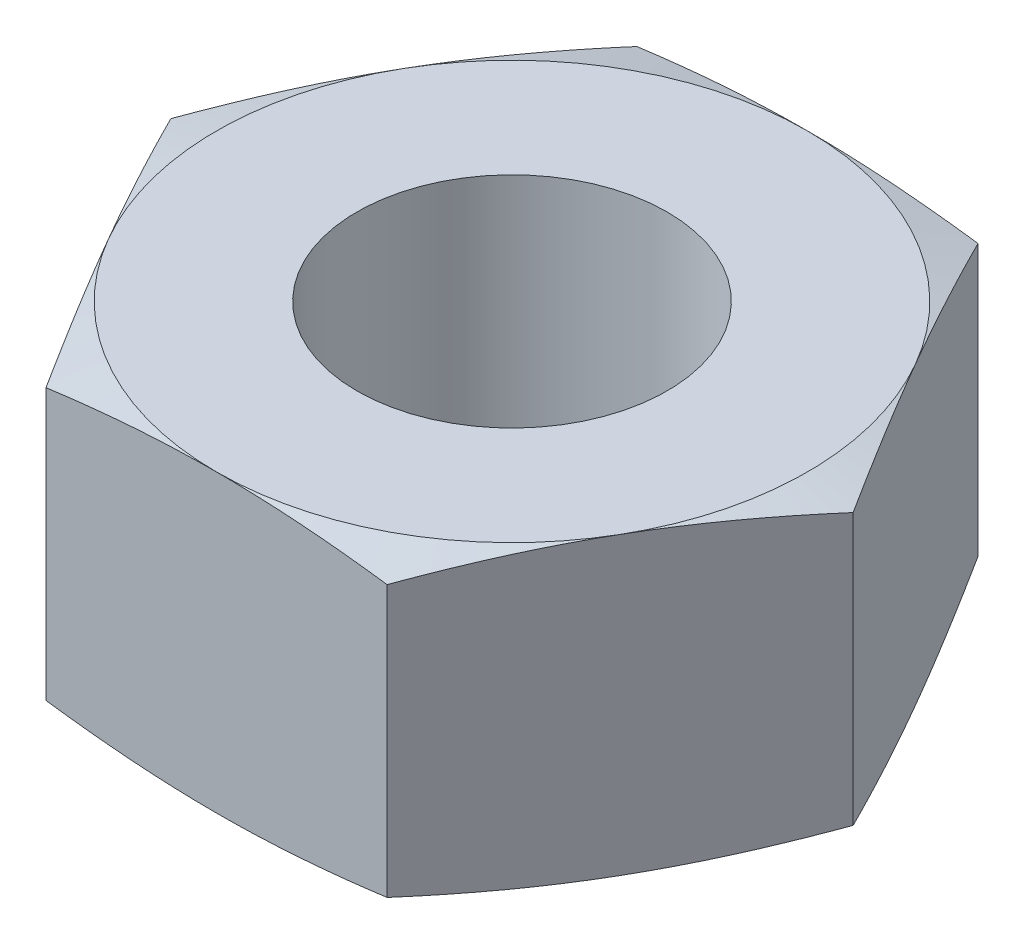
ISO-10303-21;
HEADER;
FILE_DESCRIPTION(('STEP AP214'),'2;1');
FILE_NAME('part.step','',(''),(''),'','','');
FILE_SCHEMA(('AUTOMOTIVE_DESIGN { 1 0 10303 214 1 1 1 1 }'));
ENDSEC;
DATA;
#1=APPLICATION_CONTEXT('core data for automotive mechanical design processes');
#2=APPLICATION_PROTOCOL_DEFINITION('international standard','automotive_design',2000,#1);
#3=PRODUCT_CONTEXT('',#1,'mechanical');
#4=PRODUCT('Part','Part','',(#3));
#5=PRODUCT_RELATED_PRODUCT_CATEGORY('part','',(#4));
#6=PRODUCT_DEFINITION_FORMATION('','',#4);
#7=PRODUCT_DEFINITION_CONTEXT('part definition',#1,'design');
#8=PRODUCT_DEFINITION('design','',#6,#7);
#9=PRODUCT_DEFINITION_SHAPE('','',#8);
#10=(LENGTH_UNIT() NAMED_UNIT(*) SI_UNIT(.MILLI.,.METRE.));
#11=(NAMED_UNIT(*) PLANE_ANGLE_UNIT() SI_UNIT($,.RADIAN.));
#12=(NAMED_UNIT(*) SI_UNIT($,.STERADIAN.) SOLID_ANGLE_UNIT());
#13=UNCERTAINTY_MEASURE_WITH_UNIT(LENGTH_MEASURE(1.E-05),#10,'distance_accuracy_value','');
#14=(GEOMETRIC_REPRESENTATION_CONTEXT(3) GLOBAL_UNCERTAINTY_ASSIGNED_CONTEXT((#13)) GLOBAL_UNIT_ASSIGNED_CONTEXT((#10,
#11,#12)) REPRESENTATION_CONTEXT('',''));
#15=CARTESIAN_POINT('',(0.,0.,0.));
#16=DIRECTION('',(0.,0.,1.));
#17=DIRECTION('',(1.,0.,0.));
#18=AXIS2_PLACEMENT_3D('',#15,#16,#17);
#19=CARTESIAN_POINT('',(0.,4.,0.));
#20=DIRECTION('',(0.,1.,0.));
#21=DIRECTION('',(0.,0.,1.));
#22=AXIS2_PLACEMENT_3D('',#19,#20,#21);
#23=PLANE('',#22);
#24=CARTESIAN_POINT('',(0.,4.,0.));
#25=DIRECTION('',(0.,1.,0.));
#26=DIRECTION('',(0.,0.,1.));
#27=AXIS2_PLACEMENT_3D('',#24,#25,#26);
#28=CIRCLE('',#27,2.1);
#29=CARTESIAN_POINT('',(0.,4.,2.1));
#30=VERTEX_POINT('',#29);
#31=EDGE_CURVE('E293',#30,#30,#28,.T.);
#32=ORIENTED_EDGE('',*,*,#31,.F.);
#33=EDGE_LOOP('',(#32));
#34=FACE_BOUND('',#33,.T.);
#35=CARTESIAN_POINT('',(0.,4.,0.));
#36=DIRECTION('',(0.,1.,0.));
#37=DIRECTION('',(0.,0.,1.));
#38=AXIS2_PLACEMENT_3D('',#35,#36,#37);
#39=CIRCLE('',#38,3.99999999999998);
#40=CARTESIAN_POINT('',(-3.46410161513773,4.,2.00000000000002));
#41=VERTEX_POINT('',#40);
#42=CARTESIAN_POINT('',(0.,4.,3.99999999999998));
#43=VERTEX_POINT('',#42);
#44=EDGE_CURVE('E48',#41,#43,#39,.T.);
#45=ORIENTED_EDGE('',*,*,#44,.T.);
#46=CARTESIAN_POINT('',(0.,4.,0.));
#47=DIRECTION('',(0.,1.,0.));
#48=DIRECTION('',(0.,0.,1.));
#49=AXIS2_PLACEMENT_3D('',#46,#47,#48);
#50=CIRCLE('',#49,3.99999999999998);
#51=CARTESIAN_POINT('',(3.46410161513775,4.,1.99999999999997));
#52=VERTEX_POINT('',#51);
#53=EDGE_CURVE('E146',#43,#52,#50,.T.);
#54=ORIENTED_EDGE('',*,*,#53,.T.);
#55=CARTESIAN_POINT('',(3.46410161513774,4.,-2.));
#56=VERTEX_POINT('',#55);
#57=EDGE_CURVE('E11',#52,#56,#39,.T.);
#58=ORIENTED_EDGE('',*,*,#57,.T.);
#59=CARTESIAN_POINT('',(0.,4.,-3.99999999999998));
#60=VERTEX_POINT('',#59);
#61=EDGE_CURVE('E52',#56,#60,#39,.T.);
#62=ORIENTED_EDGE('',*,*,#61,.T.);
#63=CARTESIAN_POINT('',(-3.46410161513775,4.,-1.99999999999997));
#64=VERTEX_POINT('',#63);
#65=EDGE_CURVE('E506',#60,#64,#39,.T.);
#66=ORIENTED_EDGE('',*,*,#65,.T.);
#67=EDGE_CURVE('E187',#64,#41,#39,.T.);
#68=ORIENTED_EDGE('',*,*,#67,.T.);
#69=EDGE_LOOP('',(#45,#54,#58,#62,#66,#68));
#70=FACE_BOUND('',#69,.T.);
#71=ADVANCED_FACE('F43',(#34,#70),#23,.T.);
#72=CARTESIAN_POINT('',(0.,0.,0.));
#73=DIRECTION('',(0.,1.,0.));
#74=DIRECTION('',(0.,0.,1.));
#75=AXIS2_PLACEMENT_3D('',#72,#73,#74);
#76=PLANE('',#75);
#77=CARTESIAN_POINT('',(0.,0.,0.));
#78=DIRECTION('',(0.,1.,0.));
#79=DIRECTION('',(0.,0.,1.));
#80=AXIS2_PLACEMENT_3D('',#77,#78,#79);
#81=CIRCLE('',#80,2.1);
#82=CARTESIAN_POINT('',(0.,0.,2.1));
#83=VERTEX_POINT('',#82);
#84=EDGE_CURVE('E173',#83,#83,#81,.T.);
#85=ORIENTED_EDGE('',*,*,#84,.T.);
#86=EDGE_LOOP('',(#85));
#87=FACE_BOUND('',#86,.T.);
#88=CARTESIAN_POINT('',(0.,0.,0.));
#89=DIRECTION('',(0.,1.,0.));
#90=DIRECTION('',(0.,0.,1.));
#91=AXIS2_PLACEMENT_3D('',#88,#89,#90);
#92=CIRCLE('',#91,3.99999999999998);
#93=CARTESIAN_POINT('',(0.,0.,3.99999999999998));
#94=VERTEX_POINT('',#93);
#95=CARTESIAN_POINT('',(3.46410161513775,0.,1.99999999999997));
#96=VERTEX_POINT('',#95);
#97=EDGE_CURVE('E493',#94,#96,#92,.T.);
#98=ORIENTED_EDGE('',*,*,#97,.F.);
#99=CARTESIAN_POINT('',(0.,0.,0.));
#100=DIRECTION('',(0.,1.,0.));
#101=DIRECTION('',(0.,0.,1.));
#102=AXIS2_PLACEMENT_3D('',#99,#100,#101);
#103=CIRCLE('',#102,3.99999999999998);
#104=CARTESIAN_POINT('',(-3.46410161513773,0.,2.00000000000002));
#105=VERTEX_POINT('',#104);
#106=EDGE_CURVE('E142',#105,#94,#103,.T.);
#107=ORIENTED_EDGE('',*,*,#106,.F.);
#108=CARTESIAN_POINT('',(-3.46410161513775,0.,-1.99999999999997));
#109=VERTEX_POINT('',#108);
#110=EDGE_CURVE('E185',#109,#105,#103,.T.);
#111=ORIENTED_EDGE('',*,*,#110,.F.);
#112=CARTESIAN_POINT('',(0.,0.,-3.99999999999998));
#113=VERTEX_POINT('',#112);
#114=EDGE_CURVE('E184',#113,#109,#103,.T.);
#115=ORIENTED_EDGE('',*,*,#114,.F.);
#116=CARTESIAN_POINT('',(3.46410161513774,0.,-2.));
#117=VERTEX_POINT('',#116);
#118=EDGE_CURVE('E183',#117,#113,#103,.T.);
#119=ORIENTED_EDGE('',*,*,#118,.F.);
#120=EDGE_CURVE('E181',#96,#117,#103,.T.);
#121=ORIENTED_EDGE('',*,*,#120,.F.);
#122=EDGE_LOOP('',(#98,#107,#111,#115,#119,#121));
#123=FACE_BOUND('',#122,.T.);
#124=ADVANCED_FACE('F205',(#87,#123),#76,.F.);
#125=CARTESIAN_POINT('',(0.,4.,0.));
#126=DIRECTION('',(0.,1.,0.));
#127=DIRECTION('',(0.,0.,1.));
#128=AXIS2_PLACEMENT_3D('',#125,#126,#127);
#129=CYLINDRICAL_SURFACE('',#128,2.1);
#130=ORIENTED_EDGE('',*,*,#84,.F.);
#131=EDGE_LOOP('',(#130));
#132=FACE_BOUND('',#131,.T.);
#133=ORIENTED_EDGE('',*,*,#31,.T.);
#134=EDGE_LOOP('',(#133));
#135=FACE_BOUND('',#134,.T.);
#136=ADVANCED_FACE('F247',(#132,#135),#129,.F.);
#137=CARTESIAN_POINT('',(0.,0.422899040959917,0.));
#138=DIRECTION('',(0.,1.,0.));
#139=DIRECTION('',(0.,0.,1.));
#140=AXIS2_PLACEMENT_3D('',#137,#138,#139);
#141=CONICAL_SURFACE('',#140,5.57828070733457,1.30899693899575);
#142=CARTESIAN_POINT('',(-2.30928560670462,0.165838478577418,4.0002));
#143=CARTESIAN_POINT('',(-2.40519879285118,0.140126969741108,3.83407348847834));
#144=CARTESIAN_POINT('',(-2.50128588853261,0.116785101468864,3.66764575680638));
#145=CARTESIAN_POINT('',(-2.69379944202099,0.0757755542841959,3.33420250101889));
#146=CARTESIAN_POINT('',(-2.7902260216564,0.0581101804583594,3.16718676589027));
#147=CARTESIAN_POINT('',(-2.98283386677355,0.0294849807645795,2.83358019221102));
#148=CARTESIAN_POINT('',(-3.07901382964738,0.0184910158054582,2.66699160984346));
#149=CARTESIAN_POINT('',(-3.27149641829101,0.00374922650766673,2.33360198674031));
#150=CARTESIAN_POINT('',(-3.36779901671437,0.,2.16680099337016));
#151=CARTESIAN_POINT('',(-3.56040421356107,0.,1.83319900662987));
#152=CARTESIAN_POINT('',(-3.65670681198442,0.0037492265076667,1.66639801325973));
#153=CARTESIAN_POINT('',(-3.84918940062806,0.0184910158054582,1.33300839015657));
#154=CARTESIAN_POINT('',(-3.94536936350189,0.0294849807645796,1.16641980778901));
#155=CARTESIAN_POINT('',(-4.13797720861904,0.0581101804583595,0.832813234109763));
#156=CARTESIAN_POINT('',(-4.23440378825445,0.0757755542841959,0.665797498981147));
#157=CARTESIAN_POINT('',(-4.42691734174282,0.116785101468864,0.332354243193657));
#158=CARTESIAN_POINT('',(-4.52300443742425,0.140126969741107,0.165926511521694));
#159=CARTESIAN_POINT('',(-4.61891762357082,0.165838478577418,-0.000199999999967405));
#160=B_SPLINE_CURVE_WITH_KNOTS('',3,(#142,#143,#144,#145,#146,#147,#148,#149,#150,#151,#152,
#153,#154,#155,#156,#157,#158,#159),.UNSPECIFIED.,.F.,.F.,(4,2,2,2,2,2,2,2,4),(0.,
0.580655908162844,1.1615473094924,1.73944052622642,2.31722188451987,2.89500324281332,
3.47289645954734,4.05378786087689,4.63444376903974),.UNSPECIFIED.);
#161=CARTESIAN_POINT('',(-2.3094010767586,0.165807537309234,4.));
#162=VERTEX_POINT('',#161);
#163=EDGE_CURVE('E139',#162,#105,#160,.T.);
#164=ORIENTED_EDGE('',*,*,#163,.T.);
#165=ORIENTED_EDGE('',*,*,#106,.T.);
#166=CARTESIAN_POINT('',(6.94772321100404,1.07632798891099,3.9999999999999));
#167=CARTESIAN_POINT('',(6.77939158950925,1.03724238650687,3.99999999999991));
#168=CARTESIAN_POINT('',(6.61098359218751,0.998485395888132,3.99999999999991));
#169=CARTESIAN_POINT('',(6.27398313531609,0.921769358553381,3.99999999999991));
#170=CARTESIAN_POINT('',(6.10539067276069,0.883810325049425,3.99999999999991));
#171=CARTESIAN_POINT('',(5.59923083278248,0.771328386811078,3.99999999999992));
#172=CARTESIAN_POINT('',(5.26134738191992,0.698216174034046,3.99999999999992));
#173=CARTESIAN_POINT('',(4.58128287002549,0.556789279763775,3.99999999999993));
#174=CARTESIAN_POINT('',(4.23909108460488,0.488525600189578,3.99999999999993));
#175=CARTESIAN_POINT('',(3.55310904291433,0.360267367588469,3.99999999999994));
#176=CARTESIAN_POINT('',(3.20931865207956,0.300273524206282,3.99999999999994));
#177=CARTESIAN_POINT('',(2.52901621800144,0.194152518883908,3.99999999999995));
#178=CARTESIAN_POINT('',(2.19255782304209,0.147695125375858,3.99999999999995));
#179=CARTESIAN_POINT('',(1.68647452707679,0.0906473270946316,3.99999999999996));
#180=CARTESIAN_POINT('',(1.51756269506731,0.0737387266124556,3.99999999999996));
#181=CARTESIAN_POINT('',(1.1793270364912,0.0447876576185628,3.99999999999996));
#182=CARTESIAN_POINT('',(1.01000323912352,0.0327448537912942,3.99999999999997));
#183=CARTESIAN_POINT('',(0.671785170305725,0.0141099799446411,3.99999999999997));
#184=CARTESIAN_POINT('',(0.502892202310773,0.00749459258065724,3.99999999999997));
#185=CARTESIAN_POINT('',(0.16497776491788,-3.76369125806029E-05,3.99999999999998));
#186=CARTESIAN_POINT('',(-0.00404370390315559,-0.000954504476006357,3.99999999999998));
#187=CARTESIAN_POINT('',(-0.342032035526624,0.00295930762817505,3.99999999999998));
#188=CARTESIAN_POINT('',(-0.510998893236393,0.00779042170299907,3.99999999999998));
#189=CARTESIAN_POINT('',(-0.848680148318016,0.0229494760117917,3.99999999999999));
#190=CARTESIAN_POINT('',(-1.01739454594467,0.0332774106942313,3.99999999999999));
#191=CARTESIAN_POINT('',(-1.42662162315562,0.0644474380115494,3.99999999999999));
#192=CARTESIAN_POINT('',(-1.66693557970913,0.0878981974886084,3.99999999999999));
#193=CARTESIAN_POINT('',(-2.14655806628689,0.143190256898164,4.));
#194=CARTESIAN_POINT('',(-2.38586663537111,0.175031227744845,4.));
#195=CARTESIAN_POINT('',(-2.86425610164265,0.245353434846045,4.00000000000001));
#196=CARTESIAN_POINT('',(-3.10333394892004,0.283855116355246,4.00000000000001));
#197=CARTESIAN_POINT('',(-3.58063298441912,0.365854706025524,4.00000000000002));
#198=CARTESIAN_POINT('',(-3.81885413005382,0.409352859117265,4.00000000000002));
#199=CARTESIAN_POINT('',(-4.29944374711116,0.501048516405553,4.00000000000002));
#200=CARTESIAN_POINT('',(-4.54179722113558,0.549324027933249,4.00000000000002));
#201=CARTESIAN_POINT('',(-5.02589466222567,0.648836736751685,4.00000000000003));
#202=CARTESIAN_POINT('',(-5.26763862254938,0.700073966653952,4.00000000000003));
#203=CARTESIAN_POINT('',(-5.74933379724671,0.804514441582056,4.00000000000004));
#204=CARTESIAN_POINT('',(-5.98928764717061,0.857705588309563,4.00000000000004));
#205=CARTESIAN_POINT('',(-6.46878560920919,0.965829508531589,4.00000000000005));
#206=CARTESIAN_POINT('',(-6.70832974880123,1.02076215998416,4.00000000000005));
#207=CARTESIAN_POINT('',(-6.94772321100395,1.07632798891099,4.00000000000005));
#208=B_SPLINE_CURVE_WITH_KNOTS('',3,(#166,#167,#168,#169,#170,#171,#172,#173,#174,#175,#176,
#177,#178,#179,#180,#181,#182,#183,#184,#185,#186,#187,#188,#189,#190,#191,#192,#193,#194,#195,
#196,#197,#198,#199,#200,#201,#202,#203,#204,#205,#206,#207),.UNSPECIFIED.,.F.,.F.,(4,2,2,2,2,2,
2,2,2,2,2,2,2,2,2,2,2,2,2,2,4),(0.,0.518428783163195,1.03686614338406,2.0739453682249,
3.12067977056188,4.16750393861245,5.18610652883119,5.69531646025532,6.2044912946223,
6.711466977275,7.21844039714433,7.72545213427288,8.23246335934449,8.95663312479506,
9.68077449065918,10.4071794022565,11.1336199379585,11.8749402337539,12.6162686937938,
13.353597588303,14.0908749256712),.UNSPECIFIED.);
#209=EDGE_CURVE('E140',#94,#162,#208,.T.);
#210=ORIENTED_EDGE('',*,*,#209,.T.);
#211=EDGE_LOOP('',(#164,#165,#210));
#212=FACE_BOUND('',#211,.T.);
#213=ADVANCED_FACE('F138',(#212),#141,.T.);
#214=CARTESIAN_POINT('',(-4.61891762357082,0.165838478577418,0.000200000000032253));
#215=CARTESIAN_POINT('',(-4.52300443742426,0.140126969741107,-0.16592651152163));
#216=CARTESIAN_POINT('',(-4.42691734174283,0.116785101468863,-0.332354243193595));
#217=CARTESIAN_POINT('',(-4.23440378825446,0.0757755542841958,-0.665797498981088));
#218=CARTESIAN_POINT('',(-4.13797720861905,0.0581101804583595,-0.832813234109705));
#219=CARTESIAN_POINT('',(-3.94536936350191,0.0294849807645796,-1.16641980778896));
#220=CARTESIAN_POINT('',(-3.84918940062808,0.018491015805458,-1.33300839015652));
#221=CARTESIAN_POINT('',(-3.65670681198445,0.00374922650766649,-1.66639801325967));
#222=CARTESIAN_POINT('',(-3.5604042135611,0.,-1.83319900662982));
#223=CARTESIAN_POINT('',(-3.3677990167144,0.,-2.16680099337011));
#224=CARTESIAN_POINT('',(-3.27149641829105,0.00374922650766673,-2.33360198674026));
#225=CARTESIAN_POINT('',(-3.07901382964741,0.0184910158054582,-2.66699160984342));
#226=CARTESIAN_POINT('',(-2.98283386677359,0.0294849807645795,-2.83358019221098));
#227=CARTESIAN_POINT('',(-2.79022602165644,0.0581101804583595,-3.16718676589023));
#228=CARTESIAN_POINT('',(-2.69379944202103,0.0757755542841959,-3.33420250101885));
#229=CARTESIAN_POINT('',(-2.50128588853266,0.116785101468864,-3.66764575680634));
#230=CARTESIAN_POINT('',(-2.40519879285124,0.140126969741107,-3.83407348847831));
#231=CARTESIAN_POINT('',(-2.30928560670467,0.165838478577418,-4.00019999999997));
#232=B_SPLINE_CURVE_WITH_KNOTS('',3,(#214,#215,#216,#217,#218,#219,#220,#221,#222,#223,#224,
#225,#226,#227,#228,#229,#230,#231),.UNSPECIFIED.,.F.,.F.,(4,2,2,2,2,2,2,2,4),(0.,
0.580655908162844,1.1615473094924,1.73944052622642,2.31722188451987,2.89500324281332,
3.47289645954734,4.05378786087689,4.63444376903974),.UNSPECIFIED.);
#233=CARTESIAN_POINT('',(-4.61880215351698,0.165807537309517,0.));
#234=VERTEX_POINT('',#233);
#235=EDGE_CURVE('E207',#234,#109,#232,.T.);
#236=ORIENTED_EDGE('',*,*,#235,.T.);
#237=ORIENTED_EDGE('',*,*,#110,.T.);
#238=EDGE_CURVE('E158',#105,#234,#160,.T.);
#239=ORIENTED_EDGE('',*,*,#238,.T.);
#240=EDGE_LOOP('',(#236,#237,#239));
#241=FACE_BOUND('',#240,.T.);
#242=ADVANCED_FACE('F241',(#241),#141,.T.);
#243=CARTESIAN_POINT('',(-6.94772321100401,1.07632798891099,-3.99999999999996));
#244=CARTESIAN_POINT('',(-6.77939158950922,1.03724238650687,-3.99999999999996));
#245=CARTESIAN_POINT('',(-6.61098359218748,0.998485395888133,-3.99999999999996));
#246=CARTESIAN_POINT('',(-6.27398313531606,0.921769358553382,-3.99999999999996));
#247=CARTESIAN_POINT('',(-6.10539067276067,0.883810325049426,-3.99999999999996));
#248=CARTESIAN_POINT('',(-5.59923083278245,0.771328386811078,-3.99999999999996));
#249=CARTESIAN_POINT('',(-5.26134738191988,0.698216174034046,-3.99999999999996));
#250=CARTESIAN_POINT('',(-4.58128287002546,0.556789279763776,-3.99999999999996));
#251=CARTESIAN_POINT('',(-4.23909108460485,0.488525600189578,-3.99999999999996));
#252=CARTESIAN_POINT('',(-3.5531090429143,0.360267367588469,-3.99999999999997));
#253=CARTESIAN_POINT('',(-3.20931865207953,0.300273524206282,-3.99999999999997));
#254=CARTESIAN_POINT('',(-2.52901621800141,0.194152518883908,-3.99999999999997));
#255=CARTESIAN_POINT('',(-2.19255782304207,0.147695125375858,-3.99999999999997));
#256=CARTESIAN_POINT('',(-1.68647452707676,0.0906473270946317,-3.99999999999997));
#257=CARTESIAN_POINT('',(-1.51756269506728,0.0737387266124559,-3.99999999999997));
#258=CARTESIAN_POINT('',(-1.17932703649117,0.0447876576185631,-3.99999999999997));
#259=CARTESIAN_POINT('',(-1.01000323912349,0.0327448537912944,-3.99999999999997));
#260=CARTESIAN_POINT('',(-0.671785170305695,0.0141099799446411,-3.99999999999997));
#261=CARTESIAN_POINT('',(-0.502892202310743,0.00749459258065727,-3.99999999999998));
#262=CARTESIAN_POINT('',(-0.16497776491785,-3.76369125804631E-05,-3.99999999999998));
#263=CARTESIAN_POINT('',(0.00404370390318594,-0.000954504476006079,-3.99999999999998));
#264=CARTESIAN_POINT('',(0.342032035526655,0.00295930762817535,-3.99999999999998));
#265=CARTESIAN_POINT('',(0.510998893236424,0.00779042170299926,-3.99999999999998));
#266=CARTESIAN_POINT('',(0.848680148318047,0.0229494760117919,-3.99999999999998));
#267=CARTESIAN_POINT('',(1.0173945459447,0.0332774106942315,-3.99999999999998));
#268=CARTESIAN_POINT('',(1.42662162315565,0.0644474380115498,-3.99999999999998));
#269=CARTESIAN_POINT('',(1.66693557970916,0.0878981974886089,-3.99999999999998));
#270=CARTESIAN_POINT('',(2.14655806628692,0.143190256898164,-3.99999999999998));
#271=CARTESIAN_POINT('',(2.38586663537114,0.175031227744845,-3.99999999999998));
#272=CARTESIAN_POINT('',(2.86425610164268,0.245353434846045,-3.99999999999999));
#273=CARTESIAN_POINT('',(3.10333394892007,0.283855116355246,-3.99999999999999));
#274=CARTESIAN_POINT('',(3.58063298441914,0.365854706025524,-3.99999999999999));
#275=CARTESIAN_POINT('',(3.81885413005384,0.409352859117265,-3.99999999999999));
#276=CARTESIAN_POINT('',(4.29944374711119,0.501048516405553,-3.99999999999999));
#277=CARTESIAN_POINT('',(4.54179722113561,0.549324027933249,-3.99999999999999));
#278=CARTESIAN_POINT('',(5.0258946622257,0.648836736751685,-3.99999999999999));
#279=CARTESIAN_POINT('',(5.26763862254941,0.700073966653952,-3.99999999999999));
#280=CARTESIAN_POINT('',(5.74933379724674,0.804514441582055,-4.));
#281=CARTESIAN_POINT('',(5.98928764717064,0.857705588309563,-4.));
#282=CARTESIAN_POINT('',(6.46878560920922,0.965829508531588,-4.));
#283=CARTESIAN_POINT('',(6.70832974880125,1.02076215998416,-4.));
#284=CARTESIAN_POINT('',(6.94772321100398,1.07632798891099,-4.));
#285=B_SPLINE_CURVE_WITH_KNOTS('',3,(#243,#244,#245,#246,#247,#248,#249,#250,#251,#252,#253,
#254,#255,#256,#257,#258,#259,#260,#261,#262,#263,#264,#265,#266,#267,#268,#269,#270,#271,#272,
#273,#274,#275,#276,#277,#278,#279,#280,#281,#282,#283,#284),.UNSPECIFIED.,.F.,.F.,(4,2,2,2,2,2,
2,2,2,2,2,2,2,2,2,2,2,2,2,2,4),(0.,0.518428783163193,1.03686614338406,2.0739453682249,
3.12067977056188,4.16750393861245,5.18610652883119,5.69531646025532,6.2044912946223,
6.711466977275,7.21844039714434,7.72545213427288,8.2324633593445,8.95663312479507,
9.68077449065918,10.4071794022565,11.1336199379585,11.8749402337539,12.6162686937938,
13.353597588303,14.0908749256712),.UNSPECIFIED.);
#286=CARTESIAN_POINT('',(-2.30940107675851,0.165807537309517,-3.99999999999997));
#287=VERTEX_POINT('',#286);
#288=EDGE_CURVE('E200',#287,#113,#285,.T.);
#289=ORIENTED_EDGE('',*,*,#288,.T.);
#290=ORIENTED_EDGE('',*,*,#114,.T.);
#291=EDGE_CURVE('E197',#109,#287,#232,.T.);
#292=ORIENTED_EDGE('',*,*,#291,.T.);
#293=EDGE_LOOP('',(#289,#290,#292));
#294=FACE_BOUND('',#293,.T.);
#295=ADVANCED_FACE('F194',(#294),#141,.T.);
#296=CARTESIAN_POINT('',(2.30940107675848,0.165807537309517,-3.99999999999998));
#297=VERTEX_POINT('',#296);
#298=EDGE_CURVE('E211',#113,#297,#285,.T.);
#299=ORIENTED_EDGE('',*,*,#298,.T.);
#300=CARTESIAN_POINT('',(2.30928560670464,0.165838478577418,-4.00019999999998));
#301=CARTESIAN_POINT('',(2.40519879285121,0.140126969741107,-3.83407348847832));
#302=CARTESIAN_POINT('',(2.50128588853264,0.116785101468863,-3.66764575680636));
#303=CARTESIAN_POINT('',(2.69379944202101,0.0757755542841957,-3.33420250101887));
#304=CARTESIAN_POINT('',(2.79022602165642,0.0581101804583593,-3.16718676589025));
#305=CARTESIAN_POINT('',(2.98283386677357,0.0294849807645794,-2.833580192211));
#306=CARTESIAN_POINT('',(3.0790138296474,0.018491015805458,-2.66699160984344));
#307=CARTESIAN_POINT('',(3.27149641829103,0.00374922650766657,-2.33360198674028));
#308=CARTESIAN_POINT('',(3.36779901671438,0.,-2.16680099337014));
#309=CARTESIAN_POINT('',(3.56040421356108,0.,-1.83319900662985));
#310=CARTESIAN_POINT('',(3.65670681198443,0.00374922650766677,-1.6663980132597));
#311=CARTESIAN_POINT('',(3.84918940062807,0.0184910158054583,-1.33300839015655));
#312=CARTESIAN_POINT('',(3.9453693635019,0.0294849807645797,-1.16641980778899));
#313=CARTESIAN_POINT('',(4.13797720861904,0.0581101804583597,-0.832813234109734));
#314=CARTESIAN_POINT('',(4.23440378825445,0.0757755542841961,-0.665797498981118));
#315=CARTESIAN_POINT('',(4.42691734174283,0.116785101468864,-0.332354243193626));
#316=CARTESIAN_POINT('',(4.52300443742426,0.140126969741108,-0.165926511521662));
#317=CARTESIAN_POINT('',(4.61891762357082,0.165838478577418,0.000199999999999788));
#318=B_SPLINE_CURVE_WITH_KNOTS('',3,(#300,#301,#302,#303,#304,#305,#306,#307,#308,#309,#310,
#311,#312,#313,#314,#315,#316,#317),.UNSPECIFIED.,.F.,.F.,(4,2,2,2,2,2,2,2,4),(0.,
0.580655908162844,1.1615473094924,1.73944052622642,2.31722188451987,2.89500324281332,
3.47289645954734,4.05378786087689,4.63444376903974),.UNSPECIFIED.);
#319=EDGE_CURVE('E215',#297,#117,#318,.T.);
#320=ORIENTED_EDGE('',*,*,#319,.T.);
#321=ORIENTED_EDGE('',*,*,#118,.T.);
#322=EDGE_LOOP('',(#299,#320,#321));
#323=FACE_BOUND('',#322,.T.);
#324=ADVANCED_FACE('F245',(#323),#141,.T.);
#325=CARTESIAN_POINT('',(4.61880215351698,0.165807537309517,0.));
#326=VERTEX_POINT('',#325);
#327=EDGE_CURVE('E214',#117,#326,#318,.T.);
#328=ORIENTED_EDGE('',*,*,#327,.T.);
#329=CARTESIAN_POINT('',(4.61891762357082,0.165838478577418,-0.000200000000000215));
#330=CARTESIAN_POINT('',(4.52300443742426,0.140126969741108,0.16592651152166));
#331=CARTESIAN_POINT('',(4.42691734174283,0.116785101468865,0.332354243193623));
#332=CARTESIAN_POINT('',(4.23440378825446,0.0757755542841983,0.665797498981111));
#333=CARTESIAN_POINT('',(4.13797720861906,0.0581101804583624,0.832813234109726));
#334=CARTESIAN_POINT('',(3.94536936350192,0.0294849807645832,1.16641980778898));
#335=CARTESIAN_POINT('',(3.84918940062809,0.018491015805462,1.33300839015654));
#336=CARTESIAN_POINT('',(3.65670681198446,0.00374922650767091,1.66639801325969));
#337=CARTESIAN_POINT('',(3.56040421356111,0.,1.83319900662983));
#338=CARTESIAN_POINT('',(3.36779901671441,0.,2.16680099337012));
#339=CARTESIAN_POINT('',(3.27149641829106,0.00374922650767076,2.33360198674026));
#340=CARTESIAN_POINT('',(3.07901382964743,0.0184910158054618,2.66699160984342));
#341=CARTESIAN_POINT('',(2.98283386677361,0.029484980764583,2.83358019221098));
#342=CARTESIAN_POINT('',(2.79022602165647,0.0581101804583621,3.16718676589022));
#343=CARTESIAN_POINT('',(2.69379944202106,0.0757755542841979,3.33420250101884));
#344=CARTESIAN_POINT('',(2.50128588853269,0.116785101468864,3.66764575680633));
#345=CARTESIAN_POINT('',(2.40519879285126,0.140126969741107,3.83407348847829));
#346=CARTESIAN_POINT('',(2.3092856067047,0.165838478577418,4.00019999999995));
#347=B_SPLINE_CURVE_WITH_KNOTS('',3,(#329,#330,#331,#332,#333,#334,#335,#336,#337,#338,#339,
#340,#341,#342,#343,#344,#345,#346),.UNSPECIFIED.,.F.,.F.,(4,2,2,2,2,2,2,2,4),(0.,
0.580655908162836,1.16154730949238,1.73944052622639,2.31722188451984,2.89500324281328,
3.4728964595473,4.05378786087684,4.63444376903968),.UNSPECIFIED.);
#348=EDGE_CURVE('E70',#326,#96,#347,.T.);
#349=ORIENTED_EDGE('',*,*,#348,.T.);
#350=ORIENTED_EDGE('',*,*,#120,.T.);
#351=EDGE_LOOP('',(#328,#349,#350));
#352=FACE_BOUND('',#351,.T.);
#353=ADVANCED_FACE('F405',(#352),#141,.T.);
#354=CARTESIAN_POINT('',(2.30940107675854,0.165807537309517,3.99999999999995));
#355=VERTEX_POINT('',#354);
#356=EDGE_CURVE('E157',#96,#355,#347,.T.);
#357=ORIENTED_EDGE('',*,*,#356,.T.);
#358=EDGE_CURVE('E150',#355,#94,#208,.T.);
#359=ORIENTED_EDGE('',*,*,#358,.T.);
#360=ORIENTED_EDGE('',*,*,#97,.T.);
#361=EDGE_LOOP('',(#357,#359,#360));
#362=FACE_BOUND('',#361,.T.);
#363=ADVANCED_FACE('F395',(#362),#141,.T.);
#364=CARTESIAN_POINT('',(0.,4.,0.));
#365=DIRECTION('',(0.,-1.,0.));
#366=DIRECTION('',(0.,0.,-1.));
#367=AXIS2_PLACEMENT_3D('',#364,#365,#366);
#368=CONICAL_SURFACE('',#367,3.99999999999998,1.30899693899575);
#369=CARTESIAN_POINT('',(-4.61891762357082,3.83416152142258,-0.000199999999967788));
#370=CARTESIAN_POINT('',(-4.52300443742425,3.85987303025889,0.165926511521693));
#371=CARTESIAN_POINT('',(-4.42691734174282,3.88321489853114,0.332354243193657));
#372=CARTESIAN_POINT('',(-4.23440378825445,3.9242244457158,0.665797498981147));
#373=CARTESIAN_POINT('',(-4.13797720861904,3.94188981954164,0.832813234109762));
#374=CARTESIAN_POINT('',(-3.94536936350189,3.97051501923542,1.16641980778901));
#375=CARTESIAN_POINT('',(-3.84918940062806,3.98150898419454,1.33300839015657));
#376=CARTESIAN_POINT('',(-3.65670681198442,3.99625077349233,1.66639801325973));
#377=CARTESIAN_POINT('',(-3.56040421356107,4.,1.83319900662987));
#378=CARTESIAN_POINT('',(-3.36779901671437,4.,2.16680099337016));
#379=CARTESIAN_POINT('',(-3.27149641829101,3.99625077349233,2.33360198674031));
#380=CARTESIAN_POINT('',(-3.07901382964738,3.98150898419454,2.66699160984346));
#381=CARTESIAN_POINT('',(-2.98283386677355,3.97051501923542,2.83358019221102));
#382=CARTESIAN_POINT('',(-2.7902260216564,3.94188981954164,3.16718676589027));
#383=CARTESIAN_POINT('',(-2.69379944202099,3.9242244457158,3.33420250101888));
#384=CARTESIAN_POINT('',(-2.50128588853261,3.88321489853114,3.66764575680638));
#385=CARTESIAN_POINT('',(-2.40519879285118,3.85987303025889,3.83407348847834));
#386=CARTESIAN_POINT('',(-2.30928560670462,3.83416152142258,4.0002));
#387=B_SPLINE_CURVE_WITH_KNOTS('',3,(#369,#370,#371,#372,#373,#374,#375,#376,#377,#378,#379,
#380,#381,#382,#383,#384,#385,#386),.UNSPECIFIED.,.F.,.F.,(4,2,2,2,2,2,2,2,4),(0.,
0.580655908162844,1.1615473094924,1.73944052622642,2.31722188451987,2.89500324281332,
3.47289645954734,4.05378786087689,4.63444376903974),.UNSPECIFIED.);
#388=CARTESIAN_POINT('',(-2.30940107675845,3.83419246269048,4.));
#389=VERTEX_POINT('',#388);
#390=EDGE_CURVE('E319',#41,#389,#387,.T.);
#391=ORIENTED_EDGE('',*,*,#390,.T.);
#392=CARTESIAN_POINT('',(-6.94772321100395,2.92367201108901,4.00000000000005));
#393=CARTESIAN_POINT('',(-6.77939158950917,2.96275761349313,4.00000000000005));
#394=CARTESIAN_POINT('',(-6.61098359218743,3.00151460411187,4.00000000000005));
#395=CARTESIAN_POINT('',(-6.27398313531601,3.07823064144662,4.00000000000004));
#396=CARTESIAN_POINT('',(-6.10539067276061,3.11618967495057,4.00000000000004));
#397=CARTESIAN_POINT('',(-5.59923083278239,3.22867161318892,4.00000000000004));
#398=CARTESIAN_POINT('',(-5.26134738191983,3.30178382596595,4.00000000000003));
#399=CARTESIAN_POINT('',(-4.58128287002541,3.44321072023622,4.00000000000002));
#400=CARTESIAN_POINT('',(-4.2390910846048,3.51147439981042,4.00000000000002));
#401=CARTESIAN_POINT('',(-3.55310904291425,3.63973263241153,4.00000000000001));
#402=CARTESIAN_POINT('',(-3.20931865207948,3.69972647579372,4.00000000000001));
#403=CARTESIAN_POINT('',(-2.52901621800136,3.80584748111609,4.));
#404=CARTESIAN_POINT('',(-2.19255782304201,3.85230487462414,4.));
#405=CARTESIAN_POINT('',(-1.6864745270767,3.90935267290537,3.99999999999999));
#406=CARTESIAN_POINT('',(-1.51756269506723,3.92626127338754,3.99999999999999));
#407=CARTESIAN_POINT('',(-1.17932703649111,3.95521234238144,3.99999999999999));
#408=CARTESIAN_POINT('',(-1.01000323912343,3.96725514620871,3.99999999999999));
#409=CARTESIAN_POINT('',(-0.67178517030564,3.98589002005536,3.99999999999998));
#410=CARTESIAN_POINT('',(-0.502892202310689,3.99250540741934,3.99999999999998));
#411=CARTESIAN_POINT('',(-0.164977764917796,4.00003763691258,3.99999999999998));
#412=CARTESIAN_POINT('',(0.00404370390324045,4.00095450447601,3.99999999999998));
#413=CARTESIAN_POINT('',(0.342032035526709,3.99704069237182,3.99999999999997));
#414=CARTESIAN_POINT('',(0.510998893236478,3.992209578297,3.99999999999997));
#415=CARTESIAN_POINT('',(0.848680148318101,3.97705052398821,3.99999999999997));
#416=CARTESIAN_POINT('',(1.01739454594475,3.96672258930577,3.99999999999997));
#417=CARTESIAN_POINT('',(1.4266216231557,3.93555256198845,3.99999999999996));
#418=CARTESIAN_POINT('',(1.66693557970921,3.91210180251139,3.99999999999996));
#419=CARTESIAN_POINT('',(2.14655806628697,3.85680974310184,3.99999999999995));
#420=CARTESIAN_POINT('',(2.38586663537119,3.82496877225516,3.99999999999995));
#421=CARTESIAN_POINT('',(2.86425610164274,3.75464656515396,3.99999999999995));
#422=CARTESIAN_POINT('',(3.10333394892013,3.71614488364475,3.99999999999994));
#423=CARTESIAN_POINT('',(3.5806329844192,3.63414529397448,3.99999999999994));
#424=CARTESIAN_POINT('',(3.8188541300539,3.59064714088274,3.99999999999994));
#425=CARTESIAN_POINT('',(4.29944374711124,3.49895148359445,3.99999999999993));
#426=CARTESIAN_POINT('',(4.54179722113567,3.45067597206675,3.99999999999993));
#427=CARTESIAN_POINT('',(5.02589466222576,3.35116326324832,3.99999999999992));
#428=CARTESIAN_POINT('',(5.26763862254946,3.29992603334605,3.99999999999992));
#429=CARTESIAN_POINT('',(5.74933379724679,3.19548555841794,3.99999999999992));
#430=CARTESIAN_POINT('',(5.98928764717069,3.14229441169044,3.99999999999991));
#431=CARTESIAN_POINT('',(6.46878560920927,3.03417049146841,3.99999999999991));
#432=CARTESIAN_POINT('',(6.70832974880131,2.97923784001584,3.99999999999991));
#433=CARTESIAN_POINT('',(6.94772321100403,2.92367201108901,3.9999999999999));
#434=B_SPLINE_CURVE_WITH_KNOTS('',3,(#392,#393,#394,#395,#396,#397,#398,#399,#400,#401,#402,
#403,#404,#405,#406,#407,#408,#409,#410,#411,#412,#413,#414,#415,#416,#417,#418,#419,#420,#421,
#422,#423,#424,#425,#426,#427,#428,#429,#430,#431,#432,#433),.UNSPECIFIED.,.F.,.F.,(4,2,2,2,2,2,
2,2,2,2,2,2,2,2,2,2,2,2,2,2,4),(0.,0.518428783163193,1.03686614338406,2.0739453682249,
3.12067977056188,4.16750393861245,5.18610652883119,5.69531646025532,6.2044912946223,
6.711466977275,7.21844039714434,7.72545213427288,8.23246335934449,8.95663312479507,
9.68077449065918,10.4071794022565,11.1336199379585,11.8749402337539,12.6162686937938,
13.353597588303,14.0908749256712),.UNSPECIFIED.);
#435=EDGE_CURVE('E163',#389,#43,#434,.T.);
#436=ORIENTED_EDGE('',*,*,#435,.T.);
#437=ORIENTED_EDGE('',*,*,#44,.F.);
#438=EDGE_LOOP('',(#391,#436,#437));
#439=FACE_BOUND('',#438,.T.);
#440=ADVANCED_FACE('F356',(#439),#368,.T.);
#441=CARTESIAN_POINT('',(-2.30928560670467,3.83416152142258,-4.00019999999997));
#442=CARTESIAN_POINT('',(-2.40519879285124,3.85987303025889,-3.83407348847831));
#443=CARTESIAN_POINT('',(-2.50128588853266,3.88321489853114,-3.66764575680634));
#444=CARTESIAN_POINT('',(-2.69379944202103,3.9242244457158,-3.33420250101885));
#445=CARTESIAN_POINT('',(-2.79022602165644,3.94188981954164,-3.16718676589023));
#446=CARTESIAN_POINT('',(-2.98283386677359,3.97051501923542,-2.83358019221098));
#447=CARTESIAN_POINT('',(-3.07901382964741,3.98150898419454,-2.66699160984342));
#448=CARTESIAN_POINT('',(-3.27149641829105,3.99625077349233,-2.33360198674026));
#449=CARTESIAN_POINT('',(-3.3677990167144,4.,-2.16680099337012));
#450=CARTESIAN_POINT('',(-3.5604042135611,4.,-1.83319900662982));
#451=CARTESIAN_POINT('',(-3.65670681198445,3.99625077349233,-1.66639801325968));
#452=CARTESIAN_POINT('',(-3.84918940062808,3.98150898419454,-1.33300839015652));
#453=CARTESIAN_POINT('',(-3.94536936350191,3.97051501923542,-1.16641980778896));
#454=CARTESIAN_POINT('',(-4.13797720861905,3.94188981954164,-0.832813234109705));
#455=CARTESIAN_POINT('',(-4.23440378825446,3.9242244457158,-0.665797498981089));
#456=CARTESIAN_POINT('',(-4.42691734174283,3.88321489853114,-0.332354243193596));
#457=CARTESIAN_POINT('',(-4.52300443742426,3.85987303025889,-0.165926511521631));
#458=CARTESIAN_POINT('',(-4.61891762357082,3.83416152142258,0.000200000000031967));
#459=B_SPLINE_CURVE_WITH_KNOTS('',3,(#441,#442,#443,#444,#445,#446,#447,#448,#449,#450,#451,
#452,#453,#454,#455,#456,#457,#458),.UNSPECIFIED.,.F.,.F.,(4,2,2,2,2,2,2,2,4),(0.,
0.580655908162844,1.1615473094924,1.73944052622642,2.31722188451987,2.89500324281332,
3.47289645954734,4.05378786087689,4.63444376903974),.UNSPECIFIED.);
#460=CARTESIAN_POINT('',(-4.61880215351698,3.83419246269048,0.));
#461=VERTEX_POINT('',#460);
#462=EDGE_CURVE('E326',#64,#461,#459,.T.);
#463=ORIENTED_EDGE('',*,*,#462,.T.);
#464=EDGE_CURVE('E324',#461,#41,#387,.T.);
#465=ORIENTED_EDGE('',*,*,#464,.T.);
#466=ORIENTED_EDGE('',*,*,#67,.F.);
#467=EDGE_LOOP('',(#463,#465,#466));
#468=FACE_BOUND('',#467,.T.);
#469=ADVANCED_FACE('F377',(#468),#368,.T.);
#470=CARTESIAN_POINT('',(6.94772321100398,2.92367201108901,-4.));
#471=CARTESIAN_POINT('',(6.77939158950919,2.96275761349313,-4.));
#472=CARTESIAN_POINT('',(6.61098359218746,3.00151460411187,-4.));
#473=CARTESIAN_POINT('',(6.27398313531603,3.07823064144662,-4.));
#474=CARTESIAN_POINT('',(6.10539067276064,3.11618967495058,-4.));
#475=CARTESIAN_POINT('',(5.59923083278242,3.22867161318892,-3.99999999999999));
#476=CARTESIAN_POINT('',(5.26134738191986,3.30178382596596,-3.99999999999999));
#477=CARTESIAN_POINT('',(4.58128287002543,3.44321072023622,-3.99999999999999));
#478=CARTESIAN_POINT('',(4.23909108460482,3.51147439981042,-3.99999999999999));
#479=CARTESIAN_POINT('',(3.55310904291428,3.63973263241153,-3.99999999999999));
#480=CARTESIAN_POINT('',(3.2093186520795,3.69972647579372,-3.99999999999999));
#481=CARTESIAN_POINT('',(2.52901621800139,3.80584748111609,-3.99999999999999));
#482=CARTESIAN_POINT('',(2.19255782304204,3.85230487462414,-3.99999999999998));
#483=CARTESIAN_POINT('',(1.68647452707673,3.90935267290537,-3.99999999999998));
#484=CARTESIAN_POINT('',(1.51756269506726,3.92626127338754,-3.99999999999998));
#485=CARTESIAN_POINT('',(1.17932703649114,3.95521234238144,-3.99999999999998));
#486=CARTESIAN_POINT('',(1.01000323912346,3.96725514620871,-3.99999999999998));
#487=CARTESIAN_POINT('',(0.671785170305668,3.98589002005536,-3.99999999999998));
#488=CARTESIAN_POINT('',(0.502892202310717,3.99250540741934,-3.99999999999998));
#489=CARTESIAN_POINT('',(0.164977764917824,4.00003763691258,-3.99999999999998));
#490=CARTESIAN_POINT('',(-0.00404370390321232,4.00095450447601,-3.99999999999998));
#491=CARTESIAN_POINT('',(-0.342032035526681,3.99704069237182,-3.99999999999998));
#492=CARTESIAN_POINT('',(-0.51099889323645,3.992209578297,-3.99999999999998));
#493=CARTESIAN_POINT('',(-0.848680148318072,3.97705052398821,-3.99999999999997));
#494=CARTESIAN_POINT('',(-1.01739454594473,3.96672258930577,-3.99999999999997));
#495=CARTESIAN_POINT('',(-1.42662162315567,3.93555256198845,-3.99999999999997));
#496=CARTESIAN_POINT('',(-1.66693557970918,3.91210180251139,-3.99999999999997));
#497=CARTESIAN_POINT('',(-2.14655806628694,3.85680974310184,-3.99999999999997));
#498=CARTESIAN_POINT('',(-2.38586663537116,3.82496877225516,-3.99999999999997));
#499=CARTESIAN_POINT('',(-2.86425610164271,3.75464656515395,-3.99999999999997));
#500=CARTESIAN_POINT('',(-3.1033339489201,3.71614488364475,-3.99999999999997));
#501=CARTESIAN_POINT('',(-3.58063298441917,3.63414529397448,-3.99999999999997));
#502=CARTESIAN_POINT('',(-3.81885413005387,3.59064714088274,-3.99999999999997));
#503=CARTESIAN_POINT('',(-4.29944374711122,3.49895148359445,-3.99999999999996));
#504=CARTESIAN_POINT('',(-4.54179722113564,3.45067597206675,-3.99999999999996));
#505=CARTESIAN_POINT('',(-5.02589466222573,3.35116326324832,-3.99999999999996));
#506=CARTESIAN_POINT('',(-5.26763862254943,3.29992603334605,-3.99999999999996));
#507=CARTESIAN_POINT('',(-5.74933379724676,3.19548555841795,-3.99999999999996));
#508=CARTESIAN_POINT('',(-5.98928764717066,3.14229441169044,-3.99999999999996));
#509=CARTESIAN_POINT('',(-6.46878560920924,3.03417049146841,-3.99999999999996));
#510=CARTESIAN_POINT('',(-6.70832974880128,2.97923784001584,-3.99999999999996));
#511=CARTESIAN_POINT('',(-6.947723211004,2.92367201108901,-3.99999999999996));
#512=B_SPLINE_CURVE_WITH_KNOTS('',3,(#470,#471,#472,#473,#474,#475,#476,#477,#478,#479,#480,
#481,#482,#483,#484,#485,#486,#487,#488,#489,#490,#491,#492,#493,#494,#495,#496,#497,#498,#499,
#500,#501,#502,#503,#504,#505,#506,#507,#508,#509,#510,#511),.UNSPECIFIED.,.F.,.F.,(4,2,2,2,2,2,
2,2,2,2,2,2,2,2,2,2,2,2,2,2,4),(0.,0.518428783163193,1.03686614338406,2.0739453682249,
3.12067977056188,4.16750393861245,5.18610652883119,5.69531646025532,6.2044912946223,
6.711466977275,7.21844039714433,7.72545213427288,8.23246335934449,8.95663312479506,
9.68077449065918,10.4071794022565,11.1336199379585,11.8749402337539,12.6162686937938,
13.353597588303,14.0908749256712),.UNSPECIFIED.);
#513=CARTESIAN_POINT('',(-2.30940107675851,3.83419246269048,-3.99999999999997));
#514=VERTEX_POINT('',#513);
#515=EDGE_CURVE('E284',#60,#514,#512,.T.);
#516=ORIENTED_EDGE('',*,*,#515,.T.);
#517=EDGE_CURVE('E332',#514,#64,#459,.T.);
#518=ORIENTED_EDGE('',*,*,#517,.T.);
#519=ORIENTED_EDGE('',*,*,#65,.F.);
#520=EDGE_LOOP('',(#516,#518,#519));
#521=FACE_BOUND('',#520,.T.);
#522=ADVANCED_FACE('F371',(#521),#368,.T.);
#523=CARTESIAN_POINT('',(4.61891762357082,3.83416152142258,0.000200000000000067));
#524=CARTESIAN_POINT('',(4.52300443742426,3.85987303025889,-0.165926511521661));
#525=CARTESIAN_POINT('',(4.42691734174283,3.88321489853114,-0.332354243193625));
#526=CARTESIAN_POINT('',(4.23440378825445,3.9242244457158,-0.665797498981117));
#527=CARTESIAN_POINT('',(4.13797720861904,3.94188981954164,-0.832813234109733));
#528=CARTESIAN_POINT('',(3.9453693635019,3.97051501923542,-1.16641980778899));
#529=CARTESIAN_POINT('',(3.84918940062807,3.98150898419454,-1.33300839015655));
#530=CARTESIAN_POINT('',(3.65670681198443,3.99625077349233,-1.6663980132597));
#531=CARTESIAN_POINT('',(3.56040421356108,4.,-1.83319900662985));
#532=CARTESIAN_POINT('',(3.36779901671438,4.,-2.16680099337014));
#533=CARTESIAN_POINT('',(3.27149641829103,3.99625077349233,-2.33360198674028));
#534=CARTESIAN_POINT('',(3.0790138296474,3.98150898419454,-2.66699160984344));
#535=CARTESIAN_POINT('',(2.98283386677357,3.97051501923542,-2.833580192211));
#536=CARTESIAN_POINT('',(2.79022602165642,3.94188981954164,-3.16718676589025));
#537=CARTESIAN_POINT('',(2.69379944202101,3.9242244457158,-3.33420250101887));
#538=CARTESIAN_POINT('',(2.50128588853264,3.88321489853114,-3.66764575680636));
#539=CARTESIAN_POINT('',(2.40519879285121,3.85987303025889,-3.83407348847832));
#540=CARTESIAN_POINT('',(2.30928560670464,3.83416152142258,-4.00019999999998));
#541=B_SPLINE_CURVE_WITH_KNOTS('',3,(#523,#524,#525,#526,#527,#528,#529,#530,#531,#532,#533,
#534,#535,#536,#537,#538,#539,#540),.UNSPECIFIED.,.F.,.F.,(4,2,2,2,2,2,2,2,4),(0.,
0.580655908162843,1.1615473094924,1.73944052622642,2.31722188451987,2.89500324281332,
3.47289645954734,4.05378786087689,4.63444376903974),.UNSPECIFIED.);
#542=CARTESIAN_POINT('',(2.30940107675848,3.83419246269048,-3.99999999999998));
#543=VERTEX_POINT('',#542);
#544=EDGE_CURVE('E272',#56,#543,#541,.T.);
#545=ORIENTED_EDGE('',*,*,#544,.T.);
#546=EDGE_CURVE('E283',#543,#60,#512,.T.);
#547=ORIENTED_EDGE('',*,*,#546,.T.);
#548=ORIENTED_EDGE('',*,*,#61,.F.);
#549=EDGE_LOOP('',(#545,#547,#548));
#550=FACE_BOUND('',#549,.T.);
#551=ADVANCED_FACE('F361',(#550),#368,.T.);
#552=CARTESIAN_POINT('',(2.3092856067047,3.83416152142258,4.00019999999995));
#553=CARTESIAN_POINT('',(2.40519879285126,3.85987303025889,3.83407348847829));
#554=CARTESIAN_POINT('',(2.50128588853269,3.88321489853114,3.66764575680633));
#555=CARTESIAN_POINT('',(2.69379944202106,3.9242244457158,3.33420250101884));
#556=CARTESIAN_POINT('',(2.79022602165646,3.94188981954164,3.16718676589022));
#557=CARTESIAN_POINT('',(2.98283386677361,3.97051501923542,2.83358019221098));
#558=CARTESIAN_POINT('',(3.07901382964743,3.98150898419454,2.66699160984342));
#559=CARTESIAN_POINT('',(3.27149641829106,3.99625077349233,2.33360198674027));
#560=CARTESIAN_POINT('',(3.36779901671441,4.,2.16680099337012));
#561=CARTESIAN_POINT('',(3.56040421356111,4.,1.83319900662983));
#562=CARTESIAN_POINT('',(3.65670681198446,3.99625077349233,1.66639801325969));
#563=CARTESIAN_POINT('',(3.84918940062809,3.98150898419454,1.33300839015654));
#564=CARTESIAN_POINT('',(3.94536936350191,3.97051501923542,1.16641980778898));
#565=CARTESIAN_POINT('',(4.13797720861906,3.94188981954164,0.832813234109727));
#566=CARTESIAN_POINT('',(4.23440378825446,3.9242244457158,0.665797498981113));
#567=CARTESIAN_POINT('',(4.42691734174283,3.88321489853113,0.332354243193624));
#568=CARTESIAN_POINT('',(4.52300443742426,3.85987303025889,0.165926511521661));
#569=CARTESIAN_POINT('',(4.61891762357082,3.83416152142258,-0.000199999999999489));
#570=B_SPLINE_CURVE_WITH_KNOTS('',3,(#552,#553,#554,#555,#556,#557,#558,#559,#560,#561,#562,
#563,#564,#565,#566,#567,#568,#569),.UNSPECIFIED.,.F.,.F.,(4,2,2,2,2,2,2,2,4),(0.,
0.580655908162837,1.16154730949238,1.7394405262264,2.31722188451984,2.89500324281328,
3.4728964595473,4.05378786087684,4.63444376903968),.UNSPECIFIED.);
#571=CARTESIAN_POINT('',(4.61880215351698,3.83419246269048,0.));
#572=VERTEX_POINT('',#571);
#573=EDGE_CURVE('E287',#52,#572,#570,.T.);
#574=ORIENTED_EDGE('',*,*,#573,.T.);
#575=EDGE_CURVE('E278',#572,#56,#541,.T.);
#576=ORIENTED_EDGE('',*,*,#575,.T.);
#577=ORIENTED_EDGE('',*,*,#57,.F.);
#578=EDGE_LOOP('',(#574,#576,#577));
#579=FACE_BOUND('',#578,.T.);
#580=ADVANCED_FACE('F355',(#579),#368,.T.);
#581=CARTESIAN_POINT('',(2.30940107675868,3.83419246269077,3.99999999999995));
#582=VERTEX_POINT('',#581);
#583=EDGE_CURVE('E294',#582,#52,#570,.T.);
#584=ORIENTED_EDGE('',*,*,#583,.T.);
#585=ORIENTED_EDGE('',*,*,#53,.F.);
#586=EDGE_CURVE('E314',#43,#582,#434,.T.);
#587=ORIENTED_EDGE('',*,*,#586,.T.);
#588=EDGE_LOOP('',(#584,#585,#587));
#589=FACE_BOUND('',#588,.T.);
#590=ADVANCED_FACE('F246',(#589),#368,.T.);
#591=CARTESIAN_POINT('',(-2.30940107675845,4.,4.));
#592=DIRECTION('',(0.,0.,-1.));
#593=DIRECTION('',(-1.,0.,0.));
#594=AXIS2_PLACEMENT_3D('',#591,#592,#593);
#595=PLANE('',#594);
#596=ORIENTED_EDGE('',*,*,#435,.F.);
#597=DIRECTION('',(0.,-1.,0.));
#598=VECTOR('',#597,1.);
#599=CARTESIAN_POINT('',(-2.30940107675845,4.,4.));
#600=LINE('',#599,#598);
#601=EDGE_CURVE('E156',#389,#162,#600,.T.);
#602=ORIENTED_EDGE('',*,*,#601,.T.);
#603=ORIENTED_EDGE('',*,*,#209,.F.);
#604=ORIENTED_EDGE('',*,*,#358,.F.);
#605=DIRECTION('',(0.,-1.,0.));
#606=VECTOR('',#605,1.);
#607=CARTESIAN_POINT('',(2.30940107675854,4.,3.99999999999995));
#608=LINE('',#607,#606);
#609=EDGE_CURVE('E167',#582,#355,#608,.T.);
#610=ORIENTED_EDGE('',*,*,#609,.F.);
#611=ORIENTED_EDGE('',*,*,#586,.F.);
#612=EDGE_LOOP('',(#596,#602,#603,#604,#610,#611));
#613=FACE_BOUND('',#612,.T.);
#614=ADVANCED_FACE('F165',(#613),#595,.F.);
#615=CARTESIAN_POINT('',(-4.61880215351698,4.,0.));
#616=DIRECTION('',(0.866025403784435,0.,-0.500000000000007));
#617=DIRECTION('',(-0.500000000000007,0.,-0.866025403784435));
#618=AXIS2_PLACEMENT_3D('',#615,#616,#617);
#619=PLANE('',#618);
#620=ORIENTED_EDGE('',*,*,#464,.F.);
#621=DIRECTION('',(0.,-1.,0.));
#622=VECTOR('',#621,1.);
#623=CARTESIAN_POINT('',(-4.61880215351698,4.,0.));
#624=LINE('',#623,#622);
#625=EDGE_CURVE('E164',#461,#234,#624,.T.);
#626=ORIENTED_EDGE('',*,*,#625,.T.);
#627=ORIENTED_EDGE('',*,*,#238,.F.);
#628=ORIENTED_EDGE('',*,*,#163,.F.);
#629=ORIENTED_EDGE('',*,*,#601,.F.);
#630=ORIENTED_EDGE('',*,*,#390,.F.);
#631=EDGE_LOOP('',(#620,#626,#627,#628,#629,#630));
#632=FACE_BOUND('',#631,.T.);
#633=ADVANCED_FACE('F152',(#632),#619,.F.);
#634=CARTESIAN_POINT('',(-2.30940107675851,4.,-3.99999999999997));
#635=DIRECTION('',(0.866025403784442,0.,0.499999999999995));
#636=DIRECTION('',(0.499999999999995,0.,-0.866025403784442));
#637=AXIS2_PLACEMENT_3D('',#634,#635,#636);
#638=PLANE('',#637);
#639=ORIENTED_EDGE('',*,*,#517,.F.);
#640=DIRECTION('',(0.,-1.,0.));
#641=VECTOR('',#640,1.);
#642=CARTESIAN_POINT('',(-2.30940107675851,4.,-3.99999999999997));
#643=LINE('',#642,#641);
#644=EDGE_CURVE('E169',#514,#287,#643,.T.);
#645=ORIENTED_EDGE('',*,*,#644,.T.);
#646=ORIENTED_EDGE('',*,*,#291,.F.);
#647=ORIENTED_EDGE('',*,*,#235,.F.);
#648=ORIENTED_EDGE('',*,*,#625,.F.);
#649=ORIENTED_EDGE('',*,*,#462,.F.);
#650=EDGE_LOOP('',(#639,#645,#646,#647,#648,#649));
#651=FACE_BOUND('',#650,.T.);
#652=ADVANCED_FACE('F210',(#651),#638,.F.);
#653=CARTESIAN_POINT('',(2.30940107675848,4.,-3.99999999999998));
#654=DIRECTION('',(0.,0.,1.));
#655=DIRECTION('',(1.,0.,0.));
#656=AXIS2_PLACEMENT_3D('',#653,#654,#655);
#657=PLANE('',#656);
#658=ORIENTED_EDGE('',*,*,#546,.F.);
#659=DIRECTION('',(0.,-1.,0.));
#660=VECTOR('',#659,1.);
#661=CARTESIAN_POINT('',(2.30940107675848,4.,-3.99999999999998));
#662=LINE('',#661,#660);
#663=EDGE_CURVE('E180',#543,#297,#662,.T.);
#664=ORIENTED_EDGE('',*,*,#663,.T.);
#665=ORIENTED_EDGE('',*,*,#298,.F.);
#666=ORIENTED_EDGE('',*,*,#288,.F.);
#667=ORIENTED_EDGE('',*,*,#644,.F.);
#668=ORIENTED_EDGE('',*,*,#515,.F.);
#669=EDGE_LOOP('',(#658,#664,#665,#666,#667,#668));
#670=FACE_BOUND('',#669,.T.);
#671=ADVANCED_FACE('F268',(#670),#657,.F.);
#672=CARTESIAN_POINT('',(4.61880215351698,4.,0.));
#673=DIRECTION('',(-0.866025403784438,0.,0.500000000000001));
#674=DIRECTION('',(0.500000000000001,0.,0.866025403784438));
#675=AXIS2_PLACEMENT_3D('',#672,#673,#674);
#676=PLANE('',#675);
#677=ORIENTED_EDGE('',*,*,#575,.F.);
#678=DIRECTION('',(0.,-1.,0.));
#679=VECTOR('',#678,1.);
#680=CARTESIAN_POINT('',(4.61880215351698,4.,0.));
#681=LINE('',#680,#679);
#682=EDGE_CURVE('E179',#572,#326,#681,.T.);
#683=ORIENTED_EDGE('',*,*,#682,.T.);
#684=ORIENTED_EDGE('',*,*,#327,.F.);
#685=ORIENTED_EDGE('',*,*,#319,.F.);
#686=ORIENTED_EDGE('',*,*,#663,.F.);
#687=ORIENTED_EDGE('',*,*,#544,.F.);
#688=EDGE_LOOP('',(#677,#683,#684,#685,#686,#687));
#689=FACE_BOUND('',#688,.T.);
#690=ADVANCED_FACE('F264',(#689),#676,.F.);
#691=CARTESIAN_POINT('',(2.30940107675854,4.,3.99999999999995));
#692=DIRECTION('',(-0.866025403784441,0.,-0.499999999999995));
#693=DIRECTION('',(-0.499999999999995,0.,0.866025403784441));
#694=AXIS2_PLACEMENT_3D('',#691,#692,#693);
#695=PLANE('',#694);
#696=ORIENTED_EDGE('',*,*,#583,.F.);
#697=ORIENTED_EDGE('',*,*,#609,.T.);
#698=ORIENTED_EDGE('',*,*,#356,.F.);
#699=ORIENTED_EDGE('',*,*,#348,.F.);
#700=ORIENTED_EDGE('',*,*,#682,.F.);
#701=ORIENTED_EDGE('',*,*,#573,.F.);
#702=EDGE_LOOP('',(#696,#697,#698,#699,#700,#701));
#703=FACE_BOUND('',#702,.T.);
#704=ADVANCED_FACE('F44',(#703),#695,.F.);
#705=CLOSED_SHELL('',(#71,#124,#136,#213,#242,#295,#324,#353,#363,#440,#469,#522,#551,#580,#590,
#614,#633,#652,#671,#690,#704));
#706=MANIFOLD_SOLID_BREP('B2',#705);
#707=ADVANCED_BREP_SHAPE_REPRESENTATION('',(#18,#706),#14);
#708=SHAPE_DEFINITION_REPRESENTATION(#9,#707);
ENDSEC;
END-ISO-10303-21;
